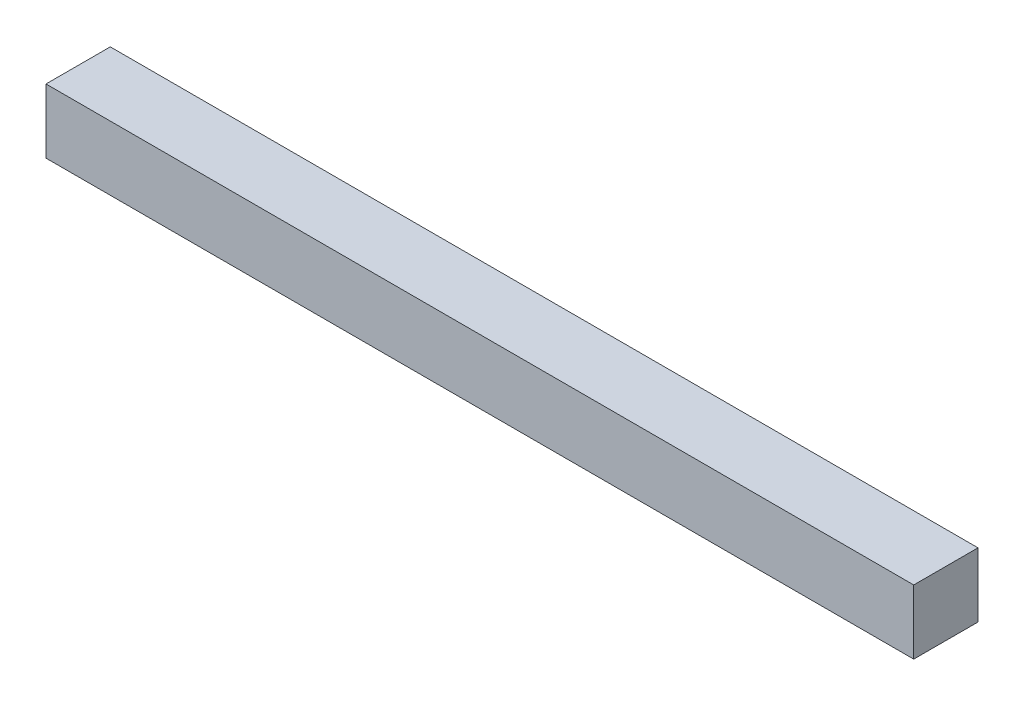
ISO-10303-21;
HEADER;
FILE_DESCRIPTION(('STEP AP214'),'2;1');
FILE_NAME('part.step','',(''),(''),'','','');
FILE_SCHEMA(('AUTOMOTIVE_DESIGN { 1 0 10303 214 1 1 1 1 }'));
ENDSEC;
DATA;
#1=APPLICATION_CONTEXT('core data for automotive mechanical design processes');
#2=APPLICATION_PROTOCOL_DEFINITION('international standard','automotive_design',2000,#1);
#3=PRODUCT_CONTEXT('',#1,'mechanical');
#4=PRODUCT('Part','Part','',(#3));
#5=PRODUCT_RELATED_PRODUCT_CATEGORY('part','',(#4));
#6=PRODUCT_DEFINITION_FORMATION('','',#4);
#7=PRODUCT_DEFINITION_CONTEXT('part definition',#1,'design');
#8=PRODUCT_DEFINITION('design','',#6,#7);
#9=PRODUCT_DEFINITION_SHAPE('','',#8);
#10=(LENGTH_UNIT() NAMED_UNIT(*) SI_UNIT(.MILLI.,.METRE.));
#11=(NAMED_UNIT(*) PLANE_ANGLE_UNIT() SI_UNIT($,.RADIAN.));
#12=(NAMED_UNIT(*) SI_UNIT($,.STERADIAN.) SOLID_ANGLE_UNIT());
#13=UNCERTAINTY_MEASURE_WITH_UNIT(LENGTH_MEASURE(1.E-05),#10,'distance_accuracy_value','');
#14=(GEOMETRIC_REPRESENTATION_CONTEXT(3) GLOBAL_UNCERTAINTY_ASSIGNED_CONTEXT((#13)) GLOBAL_UNIT_ASSIGNED_CONTEXT((#10,
#11,#12)) REPRESENTATION_CONTEXT('',''));
#15=CARTESIAN_POINT('',(0.,0.,0.));
#16=DIRECTION('',(0.,0.,1.));
#17=DIRECTION('',(1.,0.,0.));
#18=AXIS2_PLACEMENT_3D('',#15,#16,#17);
#19=CARTESIAN_POINT('',(270.,-10.,-10.));
#20=DIRECTION('',(0.,0.,1.));
#21=DIRECTION('',(1.,0.,0.));
#22=AXIS2_PLACEMENT_3D('',#19,#20,#21);
#23=PLANE('',#22);
#24=DIRECTION('',(0.,1.,0.));
#25=VECTOR('',#24,1.);
#26=CARTESIAN_POINT('',(0.,-10.,-10.));
#27=LINE('',#26,#25);
#28=CARTESIAN_POINT('',(0.,-10.,-10.));
#29=VERTEX_POINT('',#28);
#30=CARTESIAN_POINT('',(0.,10.,-10.));
#31=VERTEX_POINT('',#30);
#32=EDGE_CURVE('E114',#29,#31,#27,.T.);
#33=ORIENTED_EDGE('',*,*,#32,.T.);
#34=DIRECTION('',(-1.,0.,0.));
#35=VECTOR('',#34,1.);
#36=CARTESIAN_POINT('',(270.,10.,-10.));
#37=LINE('',#36,#35);
#38=CARTESIAN_POINT('',(270.,10.,-10.));
#39=VERTEX_POINT('',#38);
#40=EDGE_CURVE('E11',#39,#31,#37,.T.);
#41=ORIENTED_EDGE('',*,*,#40,.F.);
#42=DIRECTION('',(0.,1.,0.));
#43=VECTOR('',#42,1.);
#44=CARTESIAN_POINT('',(270.,-10.,-10.));
#45=LINE('',#44,#43);
#46=CARTESIAN_POINT('',(270.,-10.,-10.));
#47=VERTEX_POINT('',#46);
#48=EDGE_CURVE('E100',#47,#39,#45,.T.);
#49=ORIENTED_EDGE('',*,*,#48,.F.);
#50=DIRECTION('',(-1.,0.,0.));
#51=VECTOR('',#50,1.);
#52=CARTESIAN_POINT('',(270.,-10.,-10.));
#53=LINE('',#52,#51);
#54=EDGE_CURVE('E108',#47,#29,#53,.T.);
#55=ORIENTED_EDGE('',*,*,#54,.T.);
#56=EDGE_LOOP('',(#33,#41,#49,#55));
#57=FACE_BOUND('',#56,.T.);
#58=ADVANCED_FACE('F44',(#57),#23,.F.);
#59=CARTESIAN_POINT('',(270.,10.,10.));
#60=DIRECTION('',(0.,-1.,0.));
#61=DIRECTION('',(0.,0.,-1.));
#62=AXIS2_PLACEMENT_3D('',#59,#60,#61);
#63=PLANE('',#62);
#64=DIRECTION('',(0.,0.,1.));
#65=VECTOR('',#64,1.);
#66=CARTESIAN_POINT('',(0.,10.,10.));
#67=LINE('',#66,#65);
#68=CARTESIAN_POINT('',(0.,10.,10.));
#69=VERTEX_POINT('',#68);
#70=EDGE_CURVE('E105',#31,#69,#67,.T.);
#71=ORIENTED_EDGE('',*,*,#70,.T.);
#72=DIRECTION('',(-1.,0.,0.));
#73=VECTOR('',#72,1.);
#74=CARTESIAN_POINT('',(270.,10.,10.));
#75=LINE('',#74,#73);
#76=CARTESIAN_POINT('',(270.,10.,10.));
#77=VERTEX_POINT('',#76);
#78=EDGE_CURVE('E53',#77,#69,#75,.T.);
#79=ORIENTED_EDGE('',*,*,#78,.F.);
#80=DIRECTION('',(0.,0.,1.));
#81=VECTOR('',#80,1.);
#82=CARTESIAN_POINT('',(270.,10.,10.));
#83=LINE('',#82,#81);
#84=EDGE_CURVE('E95',#39,#77,#83,.T.);
#85=ORIENTED_EDGE('',*,*,#84,.F.);
#86=ORIENTED_EDGE('',*,*,#40,.T.);
#87=EDGE_LOOP('',(#71,#79,#85,#86));
#88=FACE_BOUND('',#87,.T.);
#89=ADVANCED_FACE('F101',(#88),#63,.F.);
#90=CARTESIAN_POINT('',(270.,-10.,10.));
#91=DIRECTION('',(0.,0.,-1.));
#92=DIRECTION('',(-1.,0.,0.));
#93=AXIS2_PLACEMENT_3D('',#90,#91,#92);
#94=PLANE('',#93);
#95=DIRECTION('',(0.,-1.,0.));
#96=VECTOR('',#95,1.);
#97=CARTESIAN_POINT('',(0.,-10.,10.));
#98=LINE('',#97,#96);
#99=CARTESIAN_POINT('',(0.,-10.,10.));
#100=VERTEX_POINT('',#99);
#101=EDGE_CURVE('E78',#69,#100,#98,.T.);
#102=ORIENTED_EDGE('',*,*,#101,.T.);
#103=DIRECTION('',(-1.,0.,0.));
#104=VECTOR('',#103,1.);
#105=CARTESIAN_POINT('',(270.,-10.,10.));
#106=LINE('',#105,#104);
#107=CARTESIAN_POINT('',(270.,-10.,10.));
#108=VERTEX_POINT('',#107);
#109=EDGE_CURVE('E102',#108,#100,#106,.T.);
#110=ORIENTED_EDGE('',*,*,#109,.F.);
#111=DIRECTION('',(0.,-1.,0.));
#112=VECTOR('',#111,1.);
#113=CARTESIAN_POINT('',(270.,-10.,10.));
#114=LINE('',#113,#112);
#115=EDGE_CURVE('E92',#77,#108,#114,.T.);
#116=ORIENTED_EDGE('',*,*,#115,.F.);
#117=ORIENTED_EDGE('',*,*,#78,.T.);
#118=EDGE_LOOP('',(#102,#110,#116,#117));
#119=FACE_BOUND('',#118,.T.);
#120=ADVANCED_FACE('F104',(#119),#94,.F.);
#121=CARTESIAN_POINT('',(270.,-10.,10.));
#122=DIRECTION('',(0.,1.,0.));
#123=DIRECTION('',(0.,0.,1.));
#124=AXIS2_PLACEMENT_3D('',#121,#122,#123);
#125=PLANE('',#124);
#126=DIRECTION('',(0.,0.,-1.));
#127=VECTOR('',#126,1.);
#128=CARTESIAN_POINT('',(0.,-10.,10.));
#129=LINE('',#128,#127);
#130=EDGE_CURVE('E83',#100,#29,#129,.T.);
#131=ORIENTED_EDGE('',*,*,#130,.T.);
#132=ORIENTED_EDGE('',*,*,#54,.F.);
#133=DIRECTION('',(0.,0.,-1.));
#134=VECTOR('',#133,1.);
#135=CARTESIAN_POINT('',(270.,-10.,10.));
#136=LINE('',#135,#134);
#137=EDGE_CURVE('E61',#108,#47,#136,.T.);
#138=ORIENTED_EDGE('',*,*,#137,.F.);
#139=ORIENTED_EDGE('',*,*,#109,.T.);
#140=EDGE_LOOP('',(#131,#132,#138,#139));
#141=FACE_BOUND('',#140,.T.);
#142=ADVANCED_FACE('F127',(#141),#125,.F.);
#143=CARTESIAN_POINT('',(270.,0.,0.));
#144=DIRECTION('',(-1.,0.,0.));
#145=DIRECTION('',(0.,0.,1.));
#146=AXIS2_PLACEMENT_3D('',#143,#144,#145);
#147=PLANE('',#146);
#148=ORIENTED_EDGE('',*,*,#48,.T.);
#149=ORIENTED_EDGE('',*,*,#84,.T.);
#150=ORIENTED_EDGE('',*,*,#115,.T.);
#151=ORIENTED_EDGE('',*,*,#137,.T.);
#152=EDGE_LOOP('',(#148,#149,#150,#151));
#153=FACE_BOUND('',#152,.T.);
#154=ADVANCED_FACE('F91',(#153),#147,.F.);
#155=CARTESIAN_POINT('',(0.,0.,0.));
#156=DIRECTION('',(-1.,0.,0.));
#157=DIRECTION('',(0.,0.,1.));
#158=AXIS2_PLACEMENT_3D('',#155,#156,#157);
#159=PLANE('',#158);
#160=ORIENTED_EDGE('',*,*,#32,.F.);
#161=ORIENTED_EDGE('',*,*,#130,.F.);
#162=ORIENTED_EDGE('',*,*,#101,.F.);
#163=ORIENTED_EDGE('',*,*,#70,.F.);
#164=EDGE_LOOP('',(#160,#161,#162,#163));
#165=FACE_BOUND('',#164,.T.);
#166=ADVANCED_FACE('F129',(#165),#159,.T.);
#167=CLOSED_SHELL('',(#58,#89,#120,#142,#154,#166));
#168=MANIFOLD_SOLID_BREP('B2',#167);
#169=ADVANCED_BREP_SHAPE_REPRESENTATION('',(#18,#168),#14);
#170=SHAPE_DEFINITION_REPRESENTATION(#9,#169);
ENDSEC;
END-ISO-10303-21;
